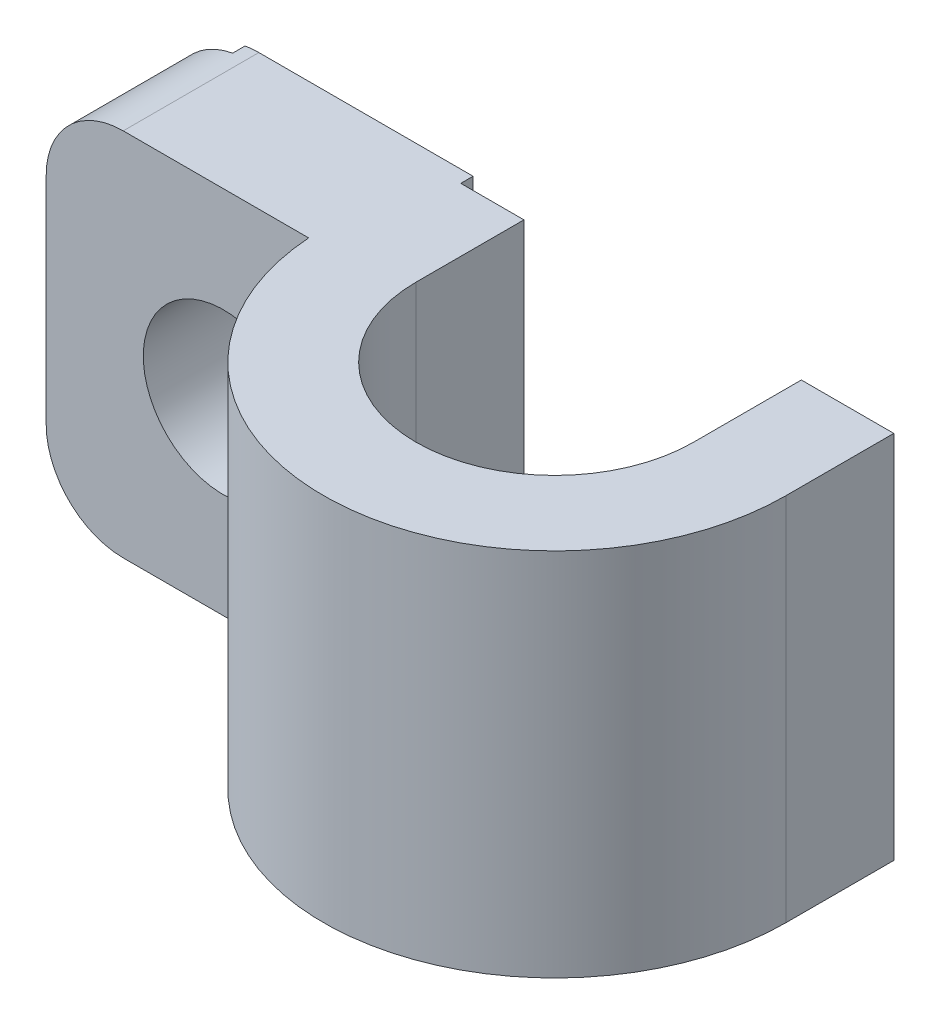
ISO-10303-21;
HEADER;
FILE_DESCRIPTION(('STEP AP214'),'2;1');
FILE_NAME('part.step','',(''),(''),'','','');
FILE_SCHEMA(('AUTOMOTIVE_DESIGN { 1 0 10303 214 1 1 1 1 }'));
ENDSEC;
DATA;
#1=APPLICATION_CONTEXT('core data for automotive mechanical design processes');
#2=APPLICATION_PROTOCOL_DEFINITION('international standard','automotive_design',2000,#1);
#3=PRODUCT_CONTEXT('',#1,'mechanical');
#4=PRODUCT('Part','Part','',(#3));
#5=PRODUCT_RELATED_PRODUCT_CATEGORY('part','',(#4));
#6=PRODUCT_DEFINITION_FORMATION('','',#4);
#7=PRODUCT_DEFINITION_CONTEXT('part definition',#1,'design');
#8=PRODUCT_DEFINITION('design','',#6,#7);
#9=PRODUCT_DEFINITION_SHAPE('','',#8);
#10=(LENGTH_UNIT() NAMED_UNIT(*) SI_UNIT(.MILLI.,.METRE.));
#11=(NAMED_UNIT(*) PLANE_ANGLE_UNIT() SI_UNIT($,.RADIAN.));
#12=(NAMED_UNIT(*) SI_UNIT($,.STERADIAN.) SOLID_ANGLE_UNIT());
#13=UNCERTAINTY_MEASURE_WITH_UNIT(LENGTH_MEASURE(1.E-05),#10,'distance_accuracy_value','');
#14=(GEOMETRIC_REPRESENTATION_CONTEXT(3) GLOBAL_UNCERTAINTY_ASSIGNED_CONTEXT((#13)) GLOBAL_UNIT_ASSIGNED_CONTEXT((#10,
#11,#12)) REPRESENTATION_CONTEXT('',''));
#15=CARTESIAN_POINT('',(0.,0.,0.));
#16=DIRECTION('',(0.,0.,1.));
#17=DIRECTION('',(1.,0.,0.));
#18=AXIS2_PLACEMENT_3D('',#15,#16,#17);
#19=CARTESIAN_POINT('',(16.,-18.6010752377383,3.5));
#20=DIRECTION('',(0.,1.,0.));
#21=DIRECTION('',(0.,0.,1.));
#22=AXIS2_PLACEMENT_3D('',#19,#20,#21);
#23=CYLINDRICAL_SURFACE('',#22,7.5);
#24=DIRECTION('',(0.,1.,0.));
#25=VECTOR('',#24,1.);
#26=CARTESIAN_POINT('',(8.51668522645212,-18.6010752377383,4.));
#27=LINE('',#26,#25);
#28=CARTESIAN_POINT('',(8.51668522645212,10.1647872523974,4.));
#29=VERTEX_POINT('',#28);
#30=CARTESIAN_POINT('',(8.51668522645212,12.,4.));
#31=VERTEX_POINT('',#30);
#32=EDGE_CURVE('E170',#29,#31,#27,.T.);
#33=ORIENTED_EDGE('',*,*,#32,.F.);
#34=CARTESIAN_POINT('',(8.51668522645212,10.1647872523974,4.));
#35=CARTESIAN_POINT('',(8.52209499324861,10.1611906341403,4.08097249150364));
#36=CARTESIAN_POINT('',(8.52881700654815,10.1567132486337,4.16180995782854));
#37=CARTESIAN_POINT('',(8.54486316721215,10.1459423097315,4.32310635120745));
#38=CARTESIAN_POINT('',(8.55418737107214,10.1396487169044,4.40356527000433));
#39=CARTESIAN_POINT('',(8.5860414799068,10.1179536614449,4.64429831877102));
#40=CARTESIAN_POINT('',(8.61244661902627,10.0997419260417,4.80383549066971));
#41=CARTESIAN_POINT('',(8.67541853191957,10.0550491206514,5.120731012096));
#42=CARTESIAN_POINT('',(8.71204600894536,10.028518530882,5.27807026012149));
#43=CARTESIAN_POINT('',(8.7948240133975,9.96632434022514,5.58834713437904));
#44=CARTESIAN_POINT('',(8.84097108903653,9.93066404862241,5.74128633321966));
#45=CARTESIAN_POINT('',(8.93377449578111,9.85571390223898,6.01715764875209));
#46=CARTESIAN_POINT('',(8.97913925262379,9.81794593229337,6.14093971450635));
#47=CARTESIAN_POINT('',(9.07528558914278,9.73450499419447,6.38363569992344));
#48=CARTESIAN_POINT('',(9.12606620886625,9.68883342605049,6.50255047715169));
#49=CARTESIAN_POINT('',(9.23200571591858,9.58899932361008,6.73425948684096));
#50=CARTESIAN_POINT('',(9.28715127925119,9.53486217179793,6.84707070087593));
#51=CARTESIAN_POINT('',(9.40082801729165,9.41732839221312,7.06596805166635));
#52=CARTESIAN_POINT('',(9.45935857793149,9.35393344072352,7.17205540091639));
#53=CARTESIAN_POINT('',(9.56843126497224,9.22881768199869,7.3593557044659));
#54=CARTESIAN_POINT('',(9.61866542822947,9.16860160533437,7.44175514161196));
#55=CARTESIAN_POINT('',(9.71961642580232,9.04117597344139,7.60068811848024));
#56=CARTESIAN_POINT('',(9.77033333631827,8.97396529692681,7.67722071427905));
#57=CARTESIAN_POINT('',(9.87122495288447,8.83249908539653,7.82389206472173));
#58=CARTESIAN_POINT('',(9.92139961604246,8.75824299756058,7.89403031678347));
#59=CARTESIAN_POINT('',(10.0201115100263,8.60281006246704,8.02745196375542));
#60=CARTESIAN_POINT('',(10.0686489090661,8.52163392922239,8.09073606435343));
#61=CARTESIAN_POINT('',(10.1632256502251,8.35221125777612,8.21040493004239));
#62=CARTESIAN_POINT('',(10.2092507749406,8.26393032474093,8.2667523212176));
#63=CARTESIAN_POINT('',(10.2974101643557,8.08118862978649,8.37187606872332));
#64=CARTESIAN_POINT('',(10.339546071287,7.98673050525403,8.42065562656853));
#65=CARTESIAN_POINT('',(10.4189310743821,7.79223773266575,8.51051569994691));
#66=CARTESIAN_POINT('',(10.4561794307048,7.69220224360818,8.55159505028243));
#67=CARTESIAN_POINT('',(10.5248739418246,7.48736171200348,8.62596925671849));
#68=CARTESIAN_POINT('',(10.5563205619359,7.3825570527973,8.65926473716267));
#69=CARTESIAN_POINT('',(10.6100835019055,7.17883579492634,8.71537805432095));
#70=CARTESIAN_POINT('',(10.63297150313,7.08025607413622,8.73887523720931));
#71=CARTESIAN_POINT('',(10.6728990400833,6.88058631874444,8.77947041049765));
#72=CARTESIAN_POINT('',(10.6899366332701,6.77949546228131,8.79656627560419));
#73=CARTESIAN_POINT('',(10.7178165679089,6.57565268739809,8.82437096065061));
#74=CARTESIAN_POINT('',(10.7286622306626,6.47290168993771,8.83508320484874));
#75=CARTESIAN_POINT('',(10.7439702308108,6.26642353574333,8.85016516434678));
#76=CARTESIAN_POINT('',(10.7484302263617,6.16269603492214,8.85453255277877));
#77=CARTESIAN_POINT('',(10.7508386545708,5.95826603904681,8.85689340410121));
#78=CARTESIAN_POINT('',(10.7489818419745,5.85756793337484,8.8550775035788));
#79=CARTESIAN_POINT('',(10.7392150865762,5.65671392057702,8.84548305129196));
#80=CARTESIAN_POINT('',(10.7313029762787,5.55655822053648,8.83770236442896));
#81=CARTESIAN_POINT('',(10.7095687892687,5.35759255256464,8.81616130021051));
#82=CARTESIAN_POINT('',(10.6957497432153,5.25878192131034,8.80240398920986));
#83=CARTESIAN_POINT('',(10.6624438696572,5.06311835207908,8.76887582072709));
#84=CARTESIAN_POINT('',(10.642954964177,4.96626614579848,8.74910275838003));
#85=CARTESIAN_POINT('',(10.5987060000861,4.77540666583461,8.703559160984));
#86=CARTESIAN_POINT('',(10.573955492087,4.68139458535798,8.67779948475974));
#87=CARTESIAN_POINT('',(10.5196104789647,4.49663944007681,8.62024386210885));
#88=CARTESIAN_POINT('',(10.490014232294,4.40589756493533,8.58844574482096));
#89=CARTESIAN_POINT('',(10.4265486550144,4.22834198668511,8.51884972793382));
#90=CARTESIAN_POINT('',(10.392681332488,4.14152646346076,8.48105464571648));
#91=CARTESIAN_POINT('',(10.3213027815546,3.97228044294921,8.39952455942678));
#92=CARTESIAN_POINT('',(10.2837902103074,3.88985157906158,8.35578736401326));
#93=CARTESIAN_POINT('',(10.1654213895713,3.64696692228294,8.21412370900876));
#94=CARTESIAN_POINT('',(10.0798769732535,3.49402109261775,8.10695116939679));
#95=CARTESIAN_POINT('',(9.90303047477674,3.2106714296102,7.87021356031629));
#96=CARTESIAN_POINT('',(9.81172707953611,3.0802727626972,7.74064337224302));
#97=CARTESIAN_POINT('',(9.62276636947213,2.83335369508273,7.45131577517871));
#98=CARTESIAN_POINT('',(9.5251472837149,2.71861307588786,7.29002141898467));
#99=CARTESIAN_POINT('',(9.33703944603483,2.513949695779,6.94861536363449));
#100=CARTESIAN_POINT('',(9.24655465274948,2.42404064498232,6.76849334461175));
#101=CARTESIAN_POINT('',(9.11309564776171,2.29945086713229,6.47235229692632));
#102=CARTESIAN_POINT('',(9.06610575674978,2.2574180126219,6.36111385175531));
#103=CARTESIAN_POINT('',(8.97684721330721,2.18019040577139,6.13441507618896));
#104=CARTESIAN_POINT('',(8.93457918813547,2.1449965614763,6.0189541875764));
#105=CARTESIAN_POINT('',(8.85531541534037,2.08086516605398,5.78447215529616));
#106=CARTESIAN_POINT('',(8.81832266458059,2.05193116633265,5.6654490340196));
#107=CARTESIAN_POINT('',(8.75004473010151,1.9998037927519,5.42453633898275));
#108=CARTESIAN_POINT('',(8.71876075908217,1.97661163824407,5.30264616237558));
#109=CARTESIAN_POINT('',(8.64620916802003,1.92384819611115,4.98687696182008));
#110=CARTESIAN_POINT('',(8.60931775473352,1.89809992909433,4.79131333174257));
#111=CARTESIAN_POINT('',(8.56573208676141,1.86817916461861,4.49577644505254));
#112=CARTESIAN_POINT('',(8.55317130484722,1.85966158779562,4.39703562402926));
#113=CARTESIAN_POINT('',(8.53197429858361,1.8453912400715,4.1989337770206));
#114=CARTESIAN_POINT('',(8.52333810027373,1.83963848751492,4.09957274692459));
#115=CARTESIAN_POINT('',(8.51668522645212,1.83521274760263,4.));
#116=B_SPLINE_CURVE_WITH_KNOTS('',3,(#34,#35,#36,#37,#38,#39,#40,#41,#42,#43,#44,#45,#46,#47,
#48,#49,#50,#51,#52,#53,#54,#55,#56,#57,#58,#59,#60,#61,#62,#63,#64,#65,#66,#67,#68,#69,#70,#71,
#72,#73,#74,#75,#76,#77,#78,#79,#80,#81,#82,#83,#84,#85,#86,#87,#88,#89,#90,#91,#92,#93,#94,#95,
#96,#97,#98,#99,#100,#101,#102,#103,#104,#105,#106,#107,#108,#109,#110,#111,#112,#113,#114,
#115),.UNSPECIFIED.,.F.,.F.,(4,2,2,2,2,2,2,2,2,2,2,2,2,2,2,2,2,2,2,2,2,2,2,2,2,2,2,2,2,2,2,2,2,
2,2,2,2,2,2,2,4),(0.,0.243665555362199,0.487336401298402,0.97495794299577,1.46553910090866,
1.95594268676864,2.36696463903135,2.77791385902269,3.18765374937631,3.5973195410883,
3.93822981954542,4.27919483286205,4.62018662225762,4.96114327047577,5.30386324398055,
5.64643783470753,5.98906422214781,6.33166311811393,6.64296105989845,6.95436226386976,
7.26559627742498,7.57694440197244,7.87878138904047,8.18072646930234,8.48251681684193,
8.78441790868822,9.08577561293829,9.38724186317348,9.68856690124663,9.99000336557861,
10.6033222898995,11.2167815636688,11.876349638645,12.5362811526065,12.9195696825754,
13.3029090687041,13.6864653682667,14.0701030510036,14.6709542345062,14.9705603403596,
15.270168434066),.UNSPECIFIED.);
#117=CARTESIAN_POINT('',(8.51668522645212,1.83521274760263,4.));
#118=VERTEX_POINT('',#117);
#119=EDGE_CURVE('E158',#29,#118,#116,.T.);
#120=ORIENTED_EDGE('',*,*,#119,.T.);
#121=CARTESIAN_POINT('',(8.51668522645212,0.,4.));
#122=VERTEX_POINT('',#121);
#123=EDGE_CURVE('E167',#122,#118,#27,.T.);
#124=ORIENTED_EDGE('',*,*,#123,.F.);
#125=CARTESIAN_POINT('',(16.,0.,3.5));
#126=DIRECTION('',(0.,1.,0.));
#127=DIRECTION('',(0.,0.,1.));
#128=AXIS2_PLACEMENT_3D('',#125,#126,#127);
#129=CIRCLE('',#128,7.5);
#130=CARTESIAN_POINT('',(23.5,0.,3.5));
#131=VERTEX_POINT('',#130);
#132=EDGE_CURVE('E374',#131,#122,#129,.F.);
#133=ORIENTED_EDGE('',*,*,#132,.F.);
#134=DIRECTION('',(0.,1.,0.));
#135=VECTOR('',#134,1.);
#136=CARTESIAN_POINT('',(23.5,-18.6010752377383,3.5));
#137=LINE('',#136,#135);
#138=CARTESIAN_POINT('',(23.5,12.,3.5));
#139=VERTEX_POINT('',#138);
#140=EDGE_CURVE('E385',#131,#139,#137,.T.);
#141=ORIENTED_EDGE('',*,*,#140,.T.);
#142=CARTESIAN_POINT('',(16.,12.,3.5));
#143=DIRECTION('',(0.,1.,0.));
#144=DIRECTION('',(0.,0.,1.));
#145=AXIS2_PLACEMENT_3D('',#142,#143,#144);
#146=CIRCLE('',#145,7.5);
#147=EDGE_CURVE('E364',#31,#139,#146,.T.);
#148=ORIENTED_EDGE('',*,*,#147,.F.);
#149=EDGE_LOOP('',(#33,#120,#124,#133,#141,#148));
#150=FACE_BOUND('',#149,.T.);
#151=ADVANCED_FACE('F39',(#150),#23,.T.);
#152=CARTESIAN_POINT('',(0.,0.,0.));
#153=DIRECTION('',(0.,0.,-1.));
#154=DIRECTION('',(-1.,0.,0.));
#155=AXIS2_PLACEMENT_3D('',#152,#153,#154);
#156=PLANE('',#155);
#157=DIRECTION('',(0.,-1.,0.));
#158=VECTOR('',#157,1.);
#159=CARTESIAN_POINT('',(0.,0.,0.));
#160=LINE('',#159,#158);
#161=CARTESIAN_POINT('',(0.,9.5,0.));
#162=VERTEX_POINT('',#161);
#163=CARTESIAN_POINT('',(0.,2.5,0.));
#164=VERTEX_POINT('',#163);
#165=EDGE_CURVE('E299',#162,#164,#160,.T.);
#166=ORIENTED_EDGE('',*,*,#165,.F.);
#167=CARTESIAN_POINT('',(2.5,9.5,0.));
#168=DIRECTION('',(0.,0.,-1.));
#169=DIRECTION('',(-1.,0.,0.));
#170=AXIS2_PLACEMENT_3D('',#167,#168,#169);
#171=CIRCLE('',#170,2.5);
#172=CARTESIAN_POINT('',(2.05,11.9591665254716,0.));
#173=VERTEX_POINT('',#172);
#174=EDGE_CURVE('E289',#162,#173,#171,.T.);
#175=ORIENTED_EDGE('',*,*,#174,.T.);
#176=DIRECTION('',(0.,1.,0.));
#177=VECTOR('',#176,1.);
#178=CARTESIAN_POINT('',(2.05,0.,0.));
#179=LINE('',#178,#177);
#180=CARTESIAN_POINT('',(2.05,0.0408334745284132,0.));
#181=VERTEX_POINT('',#180);
#182=EDGE_CURVE('E326',#181,#173,#179,.T.);
#183=ORIENTED_EDGE('',*,*,#182,.F.);
#184=CARTESIAN_POINT('',(2.5,2.5,0.));
#185=DIRECTION('',(0.,0.,-1.));
#186=DIRECTION('',(-1.,0.,0.));
#187=AXIS2_PLACEMENT_3D('',#184,#185,#186);
#188=CIRCLE('',#187,2.5);
#189=EDGE_CURVE('E292',#181,#164,#188,.T.);
#190=ORIENTED_EDGE('',*,*,#189,.T.);
#191=EDGE_LOOP('',(#166,#175,#183,#190));
#192=FACE_BOUND('',#191,.T.);
#193=ADVANCED_FACE('F235',(#192),#156,.T.);
#194=DIRECTION('',(1.,0.,0.));
#195=VECTOR('',#194,1.);
#196=CARTESIAN_POINT('',(0.,0.,0.));
#197=LINE('',#196,#195);
#198=CARTESIAN_POINT('',(9.45,0.,0.));
#199=VERTEX_POINT('',#198);
#200=CARTESIAN_POINT('',(11.5,0.,0.));
#201=VERTEX_POINT('',#200);
#202=EDGE_CURVE('E400',#199,#201,#197,.T.);
#203=ORIENTED_EDGE('',*,*,#202,.F.);
#204=DIRECTION('',(0.,-1.,0.));
#205=VECTOR('',#204,1.);
#206=CARTESIAN_POINT('',(9.45,0.,0.));
#207=LINE('',#206,#205);
#208=CARTESIAN_POINT('',(9.45,12.,0.));
#209=VERTEX_POINT('',#208);
#210=EDGE_CURVE('E330',#209,#199,#207,.T.);
#211=ORIENTED_EDGE('',*,*,#210,.F.);
#212=DIRECTION('',(-1.,0.,0.));
#213=VECTOR('',#212,1.);
#214=CARTESIAN_POINT('',(0.,12.,0.));
#215=LINE('',#214,#213);
#216=CARTESIAN_POINT('',(11.5,12.,0.));
#217=VERTEX_POINT('',#216);
#218=EDGE_CURVE('E402',#217,#209,#215,.T.);
#219=ORIENTED_EDGE('',*,*,#218,.F.);
#220=DIRECTION('',(0.,1.,0.));
#221=VECTOR('',#220,1.);
#222=CARTESIAN_POINT('',(11.5,0.,0.));
#223=LINE('',#222,#221);
#224=EDGE_CURVE('E365',#201,#217,#223,.T.);
#225=ORIENTED_EDGE('',*,*,#224,.F.);
#226=EDGE_LOOP('',(#203,#211,#219,#225));
#227=FACE_BOUND('',#226,.T.);
#228=ADVANCED_FACE('F236',(#227),#156,.T.);
#229=CARTESIAN_POINT('',(0.,0.,4.));
#230=DIRECTION('',(1.,0.,0.));
#231=DIRECTION('',(0.,0.,-1.));
#232=AXIS2_PLACEMENT_3D('',#229,#230,#231);
#233=PLANE('',#232);
#234=DIRECTION('',(0.,-1.,0.));
#235=VECTOR('',#234,1.);
#236=CARTESIAN_POINT('',(0.,0.,4.));
#237=LINE('',#236,#235);
#238=CARTESIAN_POINT('',(0.,9.5,4.));
#239=VERTEX_POINT('',#238);
#240=CARTESIAN_POINT('',(0.,2.5,4.));
#241=VERTEX_POINT('',#240);
#242=EDGE_CURVE('E298',#239,#241,#237,.T.);
#243=ORIENTED_EDGE('',*,*,#242,.F.);
#244=DIRECTION('',(0.,0.,-1.));
#245=VECTOR('',#244,1.);
#246=CARTESIAN_POINT('',(0.,9.5,4.));
#247=LINE('',#246,#245);
#248=EDGE_CURVE('E269',#239,#162,#247,.T.);
#249=ORIENTED_EDGE('',*,*,#248,.T.);
#250=ORIENTED_EDGE('',*,*,#165,.T.);
#251=DIRECTION('',(0.,0.,-1.));
#252=VECTOR('',#251,1.);
#253=CARTESIAN_POINT('',(0.,2.5,4.));
#254=LINE('',#253,#252);
#255=EDGE_CURVE('E172',#164,#241,#254,.F.);
#256=ORIENTED_EDGE('',*,*,#255,.T.);
#257=EDGE_LOOP('',(#243,#249,#250,#256));
#258=FACE_BOUND('',#257,.T.);
#259=ADVANCED_FACE('F246',(#258),#233,.F.);
#260=CARTESIAN_POINT('',(0.,0.,4.));
#261=DIRECTION('',(0.,1.,0.));
#262=DIRECTION('',(0.,0.,1.));
#263=AXIS2_PLACEMENT_3D('',#260,#261,#262);
#264=PLANE('',#263);
#265=DIRECTION('',(1.,0.,0.));
#266=VECTOR('',#265,1.);
#267=CARTESIAN_POINT('',(0.,0.,4.));
#268=LINE('',#267,#266);
#269=CARTESIAN_POINT('',(2.5,0.,4.));
#270=VERTEX_POINT('',#269);
#271=EDGE_CURVE('E176',#270,#122,#268,.T.);
#272=ORIENTED_EDGE('',*,*,#271,.F.);
#273=DIRECTION('',(0.,0.,-1.));
#274=VECTOR('',#273,1.);
#275=CARTESIAN_POINT('',(2.5,0.,4.));
#276=LINE('',#275,#274);
#277=CARTESIAN_POINT('',(2.5,0.,-0.4));
#278=VERTEX_POINT('',#277);
#279=EDGE_CURVE('E11',#270,#278,#276,.T.);
#280=ORIENTED_EDGE('',*,*,#279,.T.);
#281=DIRECTION('',(-1.,0.,0.));
#282=VECTOR('',#281,1.);
#283=CARTESIAN_POINT('',(2.05,0.,-0.4));
#284=LINE('',#283,#282);
#285=CARTESIAN_POINT('',(9.45,0.,-0.4));
#286=VERTEX_POINT('',#285);
#287=EDGE_CURVE('E308',#286,#278,#284,.T.);
#288=ORIENTED_EDGE('',*,*,#287,.F.);
#289=DIRECTION('',(0.,0.,1.));
#290=VECTOR('',#289,1.);
#291=CARTESIAN_POINT('',(9.45,0.,-0.4));
#292=LINE('',#291,#290);
#293=EDGE_CURVE('E316',#286,#199,#292,.T.);
#294=ORIENTED_EDGE('',*,*,#293,.T.);
#295=ORIENTED_EDGE('',*,*,#202,.T.);
#296=DIRECTION('',(0.,0.,1.));
#297=VECTOR('',#296,1.);
#298=CARTESIAN_POINT('',(11.5,0.,3.5));
#299=LINE('',#298,#297);
#300=CARTESIAN_POINT('',(11.5,0.,3.5));
#301=VERTEX_POINT('',#300);
#302=EDGE_CURVE('E347',#201,#301,#299,.T.);
#303=ORIENTED_EDGE('',*,*,#302,.T.);
#304=CARTESIAN_POINT('',(16.,0.,3.5));
#305=DIRECTION('',(0.,1.,0.));
#306=DIRECTION('',(0.,0.,1.));
#307=AXIS2_PLACEMENT_3D('',#304,#305,#306);
#308=CIRCLE('',#307,4.5);
#309=CARTESIAN_POINT('',(20.5,0.,3.5));
#310=VERTEX_POINT('',#309);
#311=EDGE_CURVE('E338',#301,#310,#308,.T.);
#312=ORIENTED_EDGE('',*,*,#311,.T.);
#313=DIRECTION('',(0.,0.,-1.));
#314=VECTOR('',#313,1.);
#315=CARTESIAN_POINT('',(20.5,0.,0.));
#316=LINE('',#315,#314);
#317=CARTESIAN_POINT('',(20.5,0.,0.));
#318=VERTEX_POINT('',#317);
#319=EDGE_CURVE('E342',#310,#318,#316,.T.);
#320=ORIENTED_EDGE('',*,*,#319,.T.);
#321=CARTESIAN_POINT('',(23.5,0.,0.));
#322=VERTEX_POINT('',#321);
#323=EDGE_CURVE('E399',#318,#322,#197,.T.);
#324=ORIENTED_EDGE('',*,*,#323,.T.);
#325=DIRECTION('',(0.,0.,1.));
#326=VECTOR('',#325,1.);
#327=CARTESIAN_POINT('',(23.5,0.,0.));
#328=LINE('',#327,#326);
#329=EDGE_CURVE('E377',#322,#131,#328,.T.);
#330=ORIENTED_EDGE('',*,*,#329,.T.);
#331=ORIENTED_EDGE('',*,*,#132,.T.);
#332=EDGE_LOOP('',(#272,#280,#288,#294,#295,#303,#312,#320,#324,#330,#331));
#333=FACE_BOUND('',#332,.T.);
#334=ADVANCED_FACE('F253',(#333),#264,.F.);
#335=CARTESIAN_POINT('',(0.,12.,4.));
#336=DIRECTION('',(0.,-1.,0.));
#337=DIRECTION('',(0.,0.,-1.));
#338=AXIS2_PLACEMENT_3D('',#335,#336,#337);
#339=PLANE('',#338);
#340=DIRECTION('',(1.,0.,0.));
#341=VECTOR('',#340,1.);
#342=CARTESIAN_POINT('',(2.05,12.,-0.4));
#343=LINE('',#342,#341);
#344=CARTESIAN_POINT('',(2.5,12.,-0.4));
#345=VERTEX_POINT('',#344);
#346=CARTESIAN_POINT('',(9.45,12.,-0.4));
#347=VERTEX_POINT('',#346);
#348=EDGE_CURVE('E322',#345,#347,#343,.T.);
#349=ORIENTED_EDGE('',*,*,#348,.F.);
#350=DIRECTION('',(0.,0.,-1.));
#351=VECTOR('',#350,1.);
#352=CARTESIAN_POINT('',(2.5,12.,4.));
#353=LINE('',#352,#351);
#354=CARTESIAN_POINT('',(2.5,12.,4.));
#355=VERTEX_POINT('',#354);
#356=EDGE_CURVE('E63',#345,#355,#353,.F.);
#357=ORIENTED_EDGE('',*,*,#356,.T.);
#358=DIRECTION('',(-1.,0.,0.));
#359=VECTOR('',#358,1.);
#360=CARTESIAN_POINT('',(0.,12.,4.));
#361=LINE('',#360,#359);
#362=EDGE_CURVE('E180',#31,#355,#361,.T.);
#363=ORIENTED_EDGE('',*,*,#362,.F.);
#364=ORIENTED_EDGE('',*,*,#147,.T.);
#365=DIRECTION('',(0.,0.,-1.));
#366=VECTOR('',#365,1.);
#367=CARTESIAN_POINT('',(23.5,12.,0.));
#368=LINE('',#367,#366);
#369=CARTESIAN_POINT('',(23.5,12.,0.));
#370=VERTEX_POINT('',#369);
#371=EDGE_CURVE('E381',#139,#370,#368,.T.);
#372=ORIENTED_EDGE('',*,*,#371,.T.);
#373=CARTESIAN_POINT('',(20.5,12.,0.));
#374=VERTEX_POINT('',#373);
#375=EDGE_CURVE('E182',#370,#374,#215,.T.);
#376=ORIENTED_EDGE('',*,*,#375,.T.);
#377=DIRECTION('',(0.,0.,-1.));
#378=VECTOR('',#377,1.);
#379=CARTESIAN_POINT('',(20.5,12.,0.));
#380=LINE('',#379,#378);
#381=CARTESIAN_POINT('',(20.5,12.,3.5));
#382=VERTEX_POINT('',#381);
#383=EDGE_CURVE('E355',#382,#374,#380,.T.);
#384=ORIENTED_EDGE('',*,*,#383,.F.);
#385=CARTESIAN_POINT('',(16.,12.,3.5));
#386=DIRECTION('',(0.,1.,0.));
#387=DIRECTION('',(0.,0.,1.));
#388=AXIS2_PLACEMENT_3D('',#385,#386,#387);
#389=CIRCLE('',#388,4.5);
#390=CARTESIAN_POINT('',(11.5,12.,3.5));
#391=VERTEX_POINT('',#390);
#392=EDGE_CURVE('E337',#391,#382,#389,.T.);
#393=ORIENTED_EDGE('',*,*,#392,.F.);
#394=DIRECTION('',(0.,0.,1.));
#395=VECTOR('',#394,1.);
#396=CARTESIAN_POINT('',(11.5,12.,3.5));
#397=LINE('',#396,#395);
#398=EDGE_CURVE('E343',#217,#391,#397,.T.);
#399=ORIENTED_EDGE('',*,*,#398,.F.);
#400=ORIENTED_EDGE('',*,*,#218,.T.);
#401=DIRECTION('',(0.,0.,1.));
#402=VECTOR('',#401,1.);
#403=CARTESIAN_POINT('',(9.45,12.,-0.4));
#404=LINE('',#403,#402);
#405=EDGE_CURVE('E320',#347,#209,#404,.T.);
#406=ORIENTED_EDGE('',*,*,#405,.F.);
#407=EDGE_LOOP('',(#349,#357,#363,#364,#372,#376,#384,#393,#399,#400,#406));
#408=FACE_BOUND('',#407,.T.);
#409=ADVANCED_FACE('F250',(#408),#339,.F.);
#410=CARTESIAN_POINT('',(0.,0.,4.));
#411=DIRECTION('',(0.,0.,-1.));
#412=DIRECTION('',(-1.,0.,0.));
#413=AXIS2_PLACEMENT_3D('',#410,#411,#412);
#414=PLANE('',#413);
#415=ORIENTED_EDGE('',*,*,#362,.T.);
#416=CARTESIAN_POINT('',(2.5,9.5,4.));
#417=DIRECTION('',(0.,0.,-1.));
#418=DIRECTION('',(-1.,0.,0.));
#419=AXIS2_PLACEMENT_3D('',#416,#417,#418);
#420=CIRCLE('',#419,2.5);
#421=EDGE_CURVE('E48',#355,#239,#420,.F.);
#422=ORIENTED_EDGE('',*,*,#421,.T.);
#423=ORIENTED_EDGE('',*,*,#242,.T.);
#424=CARTESIAN_POINT('',(2.5,2.5,4.));
#425=DIRECTION('',(0.,0.,-1.));
#426=DIRECTION('',(-1.,0.,0.));
#427=AXIS2_PLACEMENT_3D('',#424,#425,#426);
#428=CIRCLE('',#427,2.5);
#429=EDGE_CURVE('E55',#241,#270,#428,.F.);
#430=ORIENTED_EDGE('',*,*,#429,.T.);
#431=ORIENTED_EDGE('',*,*,#271,.T.);
#432=ORIENTED_EDGE('',*,*,#123,.T.);
#433=CARTESIAN_POINT('',(5.75,6.,4.));
#434=DIRECTION('',(0.,0.,1.));
#435=DIRECTION('',(1.,0.,0.));
#436=AXIS2_PLACEMENT_3D('',#433,#434,#435);
#437=CIRCLE('',#436,5.);
#438=EDGE_CURVE('E155',#118,#29,#437,.T.);
#439=ORIENTED_EDGE('',*,*,#438,.T.);
#440=ORIENTED_EDGE('',*,*,#32,.T.);
#441=EDGE_LOOP('',(#415,#422,#423,#430,#431,#432,#439,#440));
#442=FACE_BOUND('',#441,.T.);
#443=CARTESIAN_POINT('',(5.75,6.,4.));
#444=DIRECTION('',(0.,0.,1.));
#445=DIRECTION('',(1.,0.,0.));
#446=AXIS2_PLACEMENT_3D('',#443,#444,#445);
#447=CIRCLE('',#446,2.6);
#448=CARTESIAN_POINT('',(8.34999999999999,6.,4.));
#449=VERTEX_POINT('',#448);
#450=EDGE_CURVE('E162',#449,#449,#447,.T.);
#451=ORIENTED_EDGE('',*,*,#450,.F.);
#452=EDGE_LOOP('',(#451));
#453=FACE_BOUND('',#452,.T.);
#454=ADVANCED_FACE('F174',(#442,#453),#414,.F.);
#455=DIRECTION('',(0.,1.,0.));
#456=VECTOR('',#455,1.);
#457=CARTESIAN_POINT('',(20.5,0.,0.));
#458=LINE('',#457,#456);
#459=EDGE_CURVE('E368',#318,#374,#458,.T.);
#460=ORIENTED_EDGE('',*,*,#459,.T.);
#461=ORIENTED_EDGE('',*,*,#375,.F.);
#462=DIRECTION('',(0.,1.,0.));
#463=VECTOR('',#462,1.);
#464=CARTESIAN_POINT('',(23.5,-18.6010752377383,0.));
#465=LINE('',#464,#463);
#466=EDGE_CURVE('E378',#322,#370,#465,.T.);
#467=ORIENTED_EDGE('',*,*,#466,.F.);
#468=ORIENTED_EDGE('',*,*,#323,.F.);
#469=EDGE_LOOP('',(#460,#461,#467,#468));
#470=FACE_BOUND('',#469,.T.);
#471=ADVANCED_FACE('F228',(#470),#156,.T.);
#472=CARTESIAN_POINT('',(23.5,-18.6010752377383,0.));
#473=DIRECTION('',(1.,0.,0.));
#474=DIRECTION('',(0.,0.,-1.));
#475=AXIS2_PLACEMENT_3D('',#472,#473,#474);
#476=PLANE('',#475);
#477=ORIENTED_EDGE('',*,*,#329,.F.);
#478=ORIENTED_EDGE('',*,*,#466,.T.);
#479=ORIENTED_EDGE('',*,*,#371,.F.);
#480=ORIENTED_EDGE('',*,*,#140,.F.);
#481=EDGE_LOOP('',(#477,#478,#479,#480));
#482=FACE_BOUND('',#481,.T.);
#483=ADVANCED_FACE('F225',(#482),#476,.T.);
#484=CARTESIAN_POINT('',(16.,0.,3.5));
#485=DIRECTION('',(0.,1.,0.));
#486=DIRECTION('',(0.,0.,1.));
#487=AXIS2_PLACEMENT_3D('',#484,#485,#486);
#488=CYLINDRICAL_SURFACE('',#487,4.5);
#489=ORIENTED_EDGE('',*,*,#392,.T.);
#490=DIRECTION('',(0.,1.,0.));
#491=VECTOR('',#490,1.);
#492=CARTESIAN_POINT('',(20.5,0.,3.5));
#493=LINE('',#492,#491);
#494=EDGE_CURVE('E351',#310,#382,#493,.T.);
#495=ORIENTED_EDGE('',*,*,#494,.F.);
#496=ORIENTED_EDGE('',*,*,#311,.F.);
#497=DIRECTION('',(0.,1.,0.));
#498=VECTOR('',#497,1.);
#499=CARTESIAN_POINT('',(11.5,0.,3.5));
#500=LINE('',#499,#498);
#501=EDGE_CURVE('E361',#301,#391,#500,.T.);
#502=ORIENTED_EDGE('',*,*,#501,.T.);
#503=EDGE_LOOP('',(#489,#495,#496,#502));
#504=FACE_BOUND('',#503,.T.);
#505=ADVANCED_FACE('F219',(#504),#488,.F.);
#506=CARTESIAN_POINT('',(11.5,0.,3.5));
#507=DIRECTION('',(-1.,0.,0.));
#508=DIRECTION('',(0.,0.,1.));
#509=AXIS2_PLACEMENT_3D('',#506,#507,#508);
#510=PLANE('',#509);
#511=ORIENTED_EDGE('',*,*,#398,.T.);
#512=ORIENTED_EDGE('',*,*,#501,.F.);
#513=ORIENTED_EDGE('',*,*,#302,.F.);
#514=ORIENTED_EDGE('',*,*,#224,.T.);
#515=EDGE_LOOP('',(#511,#512,#513,#514));
#516=FACE_BOUND('',#515,.T.);
#517=ADVANCED_FACE('F216',(#516),#510,.F.);
#518=CARTESIAN_POINT('',(20.5,0.,0.));
#519=DIRECTION('',(1.,0.,0.));
#520=DIRECTION('',(0.,0.,-1.));
#521=AXIS2_PLACEMENT_3D('',#518,#519,#520);
#522=PLANE('',#521);
#523=ORIENTED_EDGE('',*,*,#383,.T.);
#524=ORIENTED_EDGE('',*,*,#459,.F.);
#525=ORIENTED_EDGE('',*,*,#319,.F.);
#526=ORIENTED_EDGE('',*,*,#494,.T.);
#527=EDGE_LOOP('',(#523,#524,#525,#526));
#528=FACE_BOUND('',#527,.T.);
#529=ADVANCED_FACE('F214',(#528),#522,.F.);
#530=CARTESIAN_POINT('',(2.05,0.,-0.4));
#531=DIRECTION('',(1.,0.,0.));
#532=DIRECTION('',(0.,0.,-1.));
#533=AXIS2_PLACEMENT_3D('',#530,#531,#532);
#534=PLANE('',#533);
#535=ORIENTED_EDGE('',*,*,#182,.T.);
#536=DIRECTION('',(0.,0.,-1.));
#537=VECTOR('',#536,1.);
#538=CARTESIAN_POINT('',(2.05,11.9591665254716,0.));
#539=LINE('',#538,#537);
#540=CARTESIAN_POINT('',(2.05,11.9591665254716,-0.4));
#541=VERTEX_POINT('',#540);
#542=EDGE_CURVE('E283',#173,#541,#539,.T.);
#543=ORIENTED_EDGE('',*,*,#542,.T.);
#544=DIRECTION('',(0.,1.,0.));
#545=VECTOR('',#544,1.);
#546=CARTESIAN_POINT('',(2.05,0.,-0.4));
#547=LINE('',#546,#545);
#548=CARTESIAN_POINT('',(2.05,0.0408334745284132,-0.4));
#549=VERTEX_POINT('',#548);
#550=EDGE_CURVE('E333',#549,#541,#547,.T.);
#551=ORIENTED_EDGE('',*,*,#550,.F.);
#552=DIRECTION('',(0.,0.,-1.));
#553=VECTOR('',#552,1.);
#554=CARTESIAN_POINT('',(2.05,0.0408334745284132,-0.4));
#555=LINE('',#554,#553);
#556=EDGE_CURVE('E286',#549,#181,#555,.F.);
#557=ORIENTED_EDGE('',*,*,#556,.T.);
#558=EDGE_LOOP('',(#535,#543,#551,#557));
#559=FACE_BOUND('',#558,.T.);
#560=ADVANCED_FACE('F210',(#559),#534,.F.);
#561=CARTESIAN_POINT('',(9.45,0.,-0.4));
#562=DIRECTION('',(-1.,0.,0.));
#563=DIRECTION('',(0.,-1.,0.));
#564=AXIS2_PLACEMENT_3D('',#561,#562,#563);
#565=PLANE('',#564);
#566=ORIENTED_EDGE('',*,*,#210,.T.);
#567=ORIENTED_EDGE('',*,*,#293,.F.);
#568=DIRECTION('',(0.,-1.,0.));
#569=VECTOR('',#568,1.);
#570=CARTESIAN_POINT('',(9.45,0.,-0.4));
#571=LINE('',#570,#569);
#572=EDGE_CURVE('E313',#347,#286,#571,.T.);
#573=ORIENTED_EDGE('',*,*,#572,.F.);
#574=ORIENTED_EDGE('',*,*,#405,.T.);
#575=EDGE_LOOP('',(#566,#567,#573,#574));
#576=FACE_BOUND('',#575,.T.);
#577=ADVANCED_FACE('F206',(#576),#565,.F.);
#578=CARTESIAN_POINT('',(0.,0.,-0.4));
#579=DIRECTION('',(0.,0.,-1.));
#580=DIRECTION('',(-1.,0.,0.));
#581=AXIS2_PLACEMENT_3D('',#578,#579,#580);
#582=PLANE('',#581);
#583=CARTESIAN_POINT('',(5.75,6.,-0.4));
#584=DIRECTION('',(0.,0.,1.));
#585=DIRECTION('',(1.,0.,0.));
#586=AXIS2_PLACEMENT_3D('',#583,#584,#585);
#587=CIRCLE('',#586,2.6);
#588=CARTESIAN_POINT('',(8.34999999999999,6.,-0.4));
#589=VERTEX_POINT('',#588);
#590=EDGE_CURVE('E331',#589,#589,#587,.T.);
#591=ORIENTED_EDGE('',*,*,#590,.T.);
#592=EDGE_LOOP('',(#591));
#593=FACE_BOUND('',#592,.T.);
#594=ORIENTED_EDGE('',*,*,#550,.T.);
#595=CARTESIAN_POINT('',(2.5,9.5,-0.4));
#596=DIRECTION('',(0.,0.,-1.));
#597=DIRECTION('',(-1.,0.,0.));
#598=AXIS2_PLACEMENT_3D('',#595,#596,#597);
#599=CIRCLE('',#598,2.5);
#600=EDGE_CURVE('E277',#541,#345,#599,.T.);
#601=ORIENTED_EDGE('',*,*,#600,.T.);
#602=ORIENTED_EDGE('',*,*,#348,.T.);
#603=ORIENTED_EDGE('',*,*,#572,.T.);
#604=ORIENTED_EDGE('',*,*,#287,.T.);
#605=CARTESIAN_POINT('',(2.5,2.5,-0.4));
#606=DIRECTION('',(0.,0.,-1.));
#607=DIRECTION('',(-1.,0.,0.));
#608=AXIS2_PLACEMENT_3D('',#605,#606,#607);
#609=CIRCLE('',#608,2.5);
#610=EDGE_CURVE('E280',#278,#549,#609,.T.);
#611=ORIENTED_EDGE('',*,*,#610,.T.);
#612=EDGE_LOOP('',(#594,#601,#602,#603,#604,#611));
#613=FACE_BOUND('',#612,.T.);
#614=ADVANCED_FACE('F202',(#593,#613),#582,.T.);
#615=CARTESIAN_POINT('',(5.75,6.,-0.4));
#616=DIRECTION('',(0.,0.,1.));
#617=DIRECTION('',(1.,0.,0.));
#618=AXIS2_PLACEMENT_3D('',#615,#616,#617);
#619=CYLINDRICAL_SURFACE('',#618,2.6);
#620=ORIENTED_EDGE('',*,*,#590,.F.);
#621=EDGE_LOOP('',(#620));
#622=FACE_BOUND('',#621,.T.);
#623=ORIENTED_EDGE('',*,*,#450,.T.);
#624=EDGE_LOOP('',(#623));
#625=FACE_BOUND('',#624,.T.);
#626=ADVANCED_FACE('F199',(#622,#625),#619,.F.);
#627=CARTESIAN_POINT('',(5.75,6.,11.));
#628=DIRECTION('',(0.,0.,-1.));
#629=DIRECTION('',(-1.,0.,0.));
#630=AXIS2_PLACEMENT_3D('',#627,#628,#629);
#631=CYLINDRICAL_SURFACE('',#630,5.);
#632=ORIENTED_EDGE('',*,*,#438,.F.);
#633=ORIENTED_EDGE('',*,*,#119,.F.);
#634=EDGE_LOOP('',(#632,#633));
#635=FACE_BOUND('',#634,.T.);
#636=ADVANCED_FACE('F157',(#635),#631,.F.);
#637=CARTESIAN_POINT('',(2.5,9.5,4.));
#638=DIRECTION('',(0.,0.,-1.));
#639=DIRECTION('',(-1.,0.,0.));
#640=AXIS2_PLACEMENT_3D('',#637,#638,#639);
#641=CYLINDRICAL_SURFACE('',#640,2.5);
#642=ORIENTED_EDGE('',*,*,#421,.F.);
#643=ORIENTED_EDGE('',*,*,#356,.F.);
#644=ORIENTED_EDGE('',*,*,#600,.F.);
#645=ORIENTED_EDGE('',*,*,#542,.F.);
#646=ORIENTED_EDGE('',*,*,#174,.F.);
#647=ORIENTED_EDGE('',*,*,#248,.F.);
#648=EDGE_LOOP('',(#642,#643,#644,#645,#646,#647));
#649=FACE_BOUND('',#648,.T.);
#650=ADVANCED_FACE('F198',(#649),#641,.T.);
#651=CARTESIAN_POINT('',(2.5,2.5,4.));
#652=DIRECTION('',(0.,0.,-1.));
#653=DIRECTION('',(-1.,0.,0.));
#654=AXIS2_PLACEMENT_3D('',#651,#652,#653);
#655=CYLINDRICAL_SURFACE('',#654,2.5);
#656=ORIENTED_EDGE('',*,*,#429,.F.);
#657=ORIENTED_EDGE('',*,*,#255,.F.);
#658=ORIENTED_EDGE('',*,*,#189,.F.);
#659=ORIENTED_EDGE('',*,*,#556,.F.);
#660=ORIENTED_EDGE('',*,*,#610,.F.);
#661=ORIENTED_EDGE('',*,*,#279,.F.);
#662=EDGE_LOOP('',(#656,#657,#658,#659,#660,#661));
#663=FACE_BOUND('',#662,.T.);
#664=ADVANCED_FACE('F41',(#663),#655,.T.);
#665=CLOSED_SHELL('',(#151,#193,#228,#259,#334,#409,#454,#471,#483,#505,#517,#529,#560,#577,
#614,#626,#636,#650,#664));
#666=MANIFOLD_SOLID_BREP('B2',#665);
#667=ADVANCED_BREP_SHAPE_REPRESENTATION('',(#18,#666),#14);
#668=SHAPE_DEFINITION_REPRESENTATION(#9,#667);
ENDSEC;
END-ISO-10303-21;
